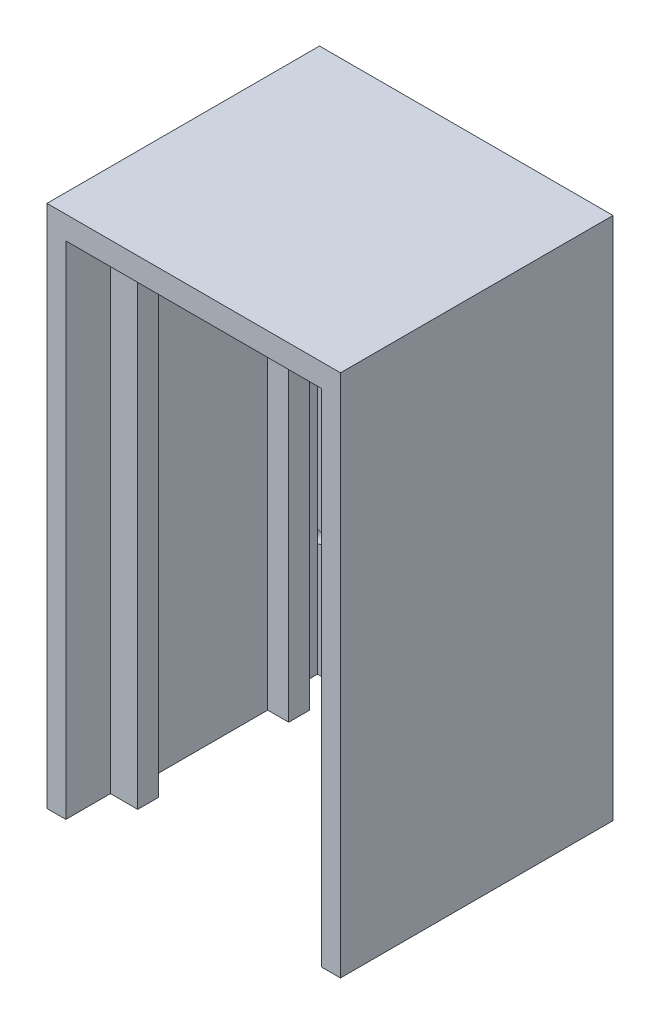
ISO-10303-21;
HEADER;
FILE_DESCRIPTION(('STEP AP214'),'2;1');
FILE_NAME('part.step','',(''),(''),'','','');
FILE_SCHEMA(('AUTOMOTIVE_DESIGN { 1 0 10303 214 1 1 1 1 }'));
ENDSEC;
DATA;
#1=APPLICATION_CONTEXT('core data for automotive mechanical design processes');
#2=APPLICATION_PROTOCOL_DEFINITION('international standard','automotive_design',2000,#1);
#3=PRODUCT_CONTEXT('',#1,'mechanical');
#4=PRODUCT('Part','Part','',(#3));
#5=PRODUCT_RELATED_PRODUCT_CATEGORY('part','',(#4));
#6=PRODUCT_DEFINITION_FORMATION('','',#4);
#7=PRODUCT_DEFINITION_CONTEXT('part definition',#1,'design');
#8=PRODUCT_DEFINITION('design','',#6,#7);
#9=PRODUCT_DEFINITION_SHAPE('','',#8);
#10=(LENGTH_UNIT() NAMED_UNIT(*) SI_UNIT(.MILLI.,.METRE.));
#11=(NAMED_UNIT(*) PLANE_ANGLE_UNIT() SI_UNIT($,.RADIAN.));
#12=(NAMED_UNIT(*) SI_UNIT($,.STERADIAN.) SOLID_ANGLE_UNIT());
#13=UNCERTAINTY_MEASURE_WITH_UNIT(LENGTH_MEASURE(1.E-05),#10,'distance_accuracy_value','');
#14=(GEOMETRIC_REPRESENTATION_CONTEXT(3) GLOBAL_UNCERTAINTY_ASSIGNED_CONTEXT((#13)) GLOBAL_UNIT_ASSIGNED_CONTEXT((#10,
#11,#12)) REPRESENTATION_CONTEXT('',''));
#15=CARTESIAN_POINT('',(0.,0.,0.));
#16=DIRECTION('',(0.,0.,1.));
#17=DIRECTION('',(1.,0.,0.));
#18=AXIS2_PLACEMENT_3D('',#15,#16,#17);
#19=CARTESIAN_POINT('',(36.,71.0305,5.));
#20=DIRECTION('',(0.,-1.,0.));
#21=DIRECTION('',(0.,0.,-1.));
#22=AXIS2_PLACEMENT_3D('',#19,#20,#21);
#23=PLANE('',#22);
#24=DIRECTION('',(0.,0.,1.));
#25=VECTOR('',#24,1.);
#26=CARTESIAN_POINT('',(-35.,71.0305,0.));
#27=LINE('',#26,#25);
#28=CARTESIAN_POINT('',(-35.,71.0305,0.));
#29=VERTEX_POINT('',#28);
#30=CARTESIAN_POINT('',(-35.,71.0305,65.));
#31=VERTEX_POINT('',#30);
#32=EDGE_CURVE('E218',#29,#31,#27,.T.);
#33=ORIENTED_EDGE('',*,*,#32,.T.);
#34=DIRECTION('',(-1.,0.,0.));
#35=VECTOR('',#34,1.);
#36=CARTESIAN_POINT('',(0.,71.0305,65.));
#37=LINE('',#36,#35);
#38=CARTESIAN_POINT('',(35.,71.0305,65.));
#39=VERTEX_POINT('',#38);
#40=EDGE_CURVE('E307',#39,#31,#37,.T.);
#41=ORIENTED_EDGE('',*,*,#40,.F.);
#42=DIRECTION('',(0.,0.,1.));
#43=VECTOR('',#42,1.);
#44=CARTESIAN_POINT('',(35.,71.0305,0.));
#45=LINE('',#44,#43);
#46=CARTESIAN_POINT('',(35.,71.0305,0.));
#47=VERTEX_POINT('',#46);
#48=EDGE_CURVE('E70',#47,#39,#45,.T.);
#49=ORIENTED_EDGE('',*,*,#48,.F.);
#50=DIRECTION('',(-1.,0.,0.));
#51=VECTOR('',#50,1.);
#52=CARTESIAN_POINT('',(36.,71.0305,0.));
#53=LINE('',#52,#51);
#54=EDGE_CURVE('E234',#47,#29,#53,.T.);
#55=ORIENTED_EDGE('',*,*,#54,.T.);
#56=EDGE_LOOP('',(#33,#41,#49,#55));
#57=FACE_BOUND('',#56,.T.);
#58=ADVANCED_FACE('F48',(#57),#23,.F.);
#59=CARTESIAN_POINT('',(36.,-53.9695,5.));
#60=DIRECTION('',(0.,1.,0.));
#61=DIRECTION('',(0.,0.,1.));
#62=AXIS2_PLACEMENT_3D('',#59,#60,#61);
#63=PLANE('',#62);
#64=DIRECTION('',(0.,0.,1.));
#65=VECTOR('',#64,1.);
#66=CARTESIAN_POINT('',(-35.,-53.9695,5.00000000000001));
#67=LINE('',#66,#65);
#68=CARTESIAN_POINT('',(-35.,-53.9695,0.));
#69=VERTEX_POINT('',#68);
#70=CARTESIAN_POINT('',(-35.,-53.9695,65.));
#71=VERTEX_POINT('',#70);
#72=EDGE_CURVE('E63',#69,#71,#67,.T.);
#73=ORIENTED_EDGE('',*,*,#72,.F.);
#74=DIRECTION('',(1.,0.,0.));
#75=VECTOR('',#74,1.);
#76=CARTESIAN_POINT('',(36.,-53.9695,0.));
#77=LINE('',#76,#75);
#78=CARTESIAN_POINT('',(35.,-53.9695,0.));
#79=VERTEX_POINT('',#78);
#80=EDGE_CURVE('E236',#69,#79,#77,.T.);
#81=ORIENTED_EDGE('',*,*,#80,.T.);
#82=DIRECTION('',(0.,0.,1.));
#83=VECTOR('',#82,1.);
#84=CARTESIAN_POINT('',(35.,-53.9695,5.));
#85=LINE('',#84,#83);
#86=CARTESIAN_POINT('',(35.,-53.9695,65.));
#87=VERTEX_POINT('',#86);
#88=EDGE_CURVE('E238',#79,#87,#85,.T.);
#89=ORIENTED_EDGE('',*,*,#88,.T.);
#90=DIRECTION('',(1.,0.,0.));
#91=VECTOR('',#90,1.);
#92=CARTESIAN_POINT('',(0.,-53.9695,65.));
#93=LINE('',#92,#91);
#94=CARTESIAN_POINT('',(30.5,-53.9695,65.));
#95=VERTEX_POINT('',#94);
#96=EDGE_CURVE('E304',#95,#87,#93,.T.);
#97=ORIENTED_EDGE('',*,*,#96,.F.);
#98=DIRECTION('',(0.,0.,-1.));
#99=VECTOR('',#98,1.);
#100=CARTESIAN_POINT('',(30.5,-53.9695,65.));
#101=LINE('',#100,#99);
#102=CARTESIAN_POINT('',(30.5,-53.9695,54.3563345930218));
#103=VERTEX_POINT('',#102);
#104=EDGE_CURVE('E324',#95,#103,#101,.T.);
#105=ORIENTED_EDGE('',*,*,#104,.T.);
#106=DIRECTION('',(1.,0.,0.));
#107=VECTOR('',#106,1.);
#108=CARTESIAN_POINT('',(0.,-53.9695,54.3563345930218));
#109=LINE('',#108,#107);
#110=CARTESIAN_POINT('',(24.,-53.9695,54.3563345930218));
#111=VERTEX_POINT('',#110);
#112=EDGE_CURVE('E459',#111,#103,#109,.T.);
#113=ORIENTED_EDGE('',*,*,#112,.F.);
#114=DIRECTION('',(0.,0.,1.));
#115=VECTOR('',#114,1.);
#116=CARTESIAN_POINT('',(24.,-53.9695,0.));
#117=LINE('',#116,#115);
#118=CARTESIAN_POINT('',(24.,-53.9695,49.3563345930218));
#119=VERTEX_POINT('',#118);
#120=EDGE_CURVE('E872',#119,#111,#117,.T.);
#121=ORIENTED_EDGE('',*,*,#120,.F.);
#122=DIRECTION('',(1.,0.,0.));
#123=VECTOR('',#122,1.);
#124=CARTESIAN_POINT('',(0.,-53.9695,49.3563345930218));
#125=LINE('',#124,#123);
#126=CARTESIAN_POINT('',(29.,-53.9695,49.3563345930218));
#127=VERTEX_POINT('',#126);
#128=EDGE_CURVE('E877',#119,#127,#125,.T.);
#129=ORIENTED_EDGE('',*,*,#128,.T.);
#130=DIRECTION('',(0.,0.,1.));
#131=VECTOR('',#130,1.);
#132=CARTESIAN_POINT('',(29.,-53.9695,0.));
#133=LINE('',#132,#131);
#134=CARTESIAN_POINT('',(29.,-53.9695,18.3563345930218));
#135=VERTEX_POINT('',#134);
#136=EDGE_CURVE('E881',#135,#127,#133,.T.);
#137=ORIENTED_EDGE('',*,*,#136,.F.);
#138=DIRECTION('',(1.,0.,0.));
#139=VECTOR('',#138,1.);
#140=CARTESIAN_POINT('',(0.,-53.9695,18.3563345930218));
#141=LINE('',#140,#139);
#142=CARTESIAN_POINT('',(24.,-53.9695,18.3563345930218));
#143=VERTEX_POINT('',#142);
#144=EDGE_CURVE('E475',#143,#135,#141,.T.);
#145=ORIENTED_EDGE('',*,*,#144,.F.);
#146=CARTESIAN_POINT('',(24.,-53.9695,13.3563345930218));
#147=VERTEX_POINT('',#146);
#148=EDGE_CURVE('E847',#147,#143,#117,.T.);
#149=ORIENTED_EDGE('',*,*,#148,.F.);
#150=DIRECTION('',(1.,0.,0.));
#151=VECTOR('',#150,1.);
#152=CARTESIAN_POINT('',(0.,-53.9695,13.3563345930218));
#153=LINE('',#152,#151);
#154=CARTESIAN_POINT('',(30.5,-53.9695,13.3563345930218));
#155=VERTEX_POINT('',#154);
#156=EDGE_CURVE('E562',#147,#155,#153,.T.);
#157=ORIENTED_EDGE('',*,*,#156,.T.);
#158=CARTESIAN_POINT('',(30.5,-53.9695,5.));
#159=VERTEX_POINT('',#158);
#160=EDGE_CURVE('E322',#155,#159,#101,.T.);
#161=ORIENTED_EDGE('',*,*,#160,.T.);
#162=DIRECTION('',(1.,0.,0.));
#163=VECTOR('',#162,1.);
#164=CARTESIAN_POINT('',(36.,-53.9695,5.));
#165=LINE('',#164,#163);
#166=CARTESIAN_POINT('',(-30.5,-53.9695,5.));
#167=VERTEX_POINT('',#166);
#168=EDGE_CURVE('E245',#167,#159,#165,.T.);
#169=ORIENTED_EDGE('',*,*,#168,.F.);
#170=DIRECTION('',(0.,0.,-1.));
#171=VECTOR('',#170,1.);
#172=CARTESIAN_POINT('',(-30.5,-53.9695,65.));
#173=LINE('',#172,#171);
#174=CARTESIAN_POINT('',(-30.5,-53.9695,13.3563345930218));
#175=VERTEX_POINT('',#174);
#176=EDGE_CURVE('E312',#175,#167,#173,.T.);
#177=ORIENTED_EDGE('',*,*,#176,.F.);
#178=DIRECTION('',(1.,0.,0.));
#179=VECTOR('',#178,1.);
#180=CARTESIAN_POINT('',(0.,-53.9695,13.3563345930218));
#181=LINE('',#180,#179);
#182=CARTESIAN_POINT('',(-24.,-53.9695,13.3563345930218));
#183=VERTEX_POINT('',#182);
#184=EDGE_CURVE('E479',#175,#183,#181,.T.);
#185=ORIENTED_EDGE('',*,*,#184,.T.);
#186=DIRECTION('',(0.,0.,1.));
#187=VECTOR('',#186,1.);
#188=CARTESIAN_POINT('',(-24.,-53.9695,0.));
#189=LINE('',#188,#187);
#190=CARTESIAN_POINT('',(-24.,-53.9695,18.3563345930218));
#191=VERTEX_POINT('',#190);
#192=EDGE_CURVE('E501',#183,#191,#189,.T.);
#193=ORIENTED_EDGE('',*,*,#192,.T.);
#194=DIRECTION('',(1.,0.,0.));
#195=VECTOR('',#194,1.);
#196=CARTESIAN_POINT('',(0.,-53.9695,18.3563345930218));
#197=LINE('',#196,#195);
#198=CARTESIAN_POINT('',(-29.,-53.9695,18.3563345930218));
#199=VERTEX_POINT('',#198);
#200=EDGE_CURVE('E505',#199,#191,#197,.T.);
#201=ORIENTED_EDGE('',*,*,#200,.F.);
#202=DIRECTION('',(0.,0.,1.));
#203=VECTOR('',#202,1.);
#204=CARTESIAN_POINT('',(-29.,-53.9695,0.));
#205=LINE('',#204,#203);
#206=CARTESIAN_POINT('',(-29.,-53.9695,49.3563345930218));
#207=VERTEX_POINT('',#206);
#208=EDGE_CURVE('E510',#199,#207,#205,.T.);
#209=ORIENTED_EDGE('',*,*,#208,.T.);
#210=DIRECTION('',(1.,0.,0.));
#211=VECTOR('',#210,1.);
#212=CARTESIAN_POINT('',(0.,-53.9695,49.3563345930218));
#213=LINE('',#212,#211);
#214=CARTESIAN_POINT('',(-24.,-53.9695,49.3563345930218));
#215=VERTEX_POINT('',#214);
#216=EDGE_CURVE('E514',#207,#215,#213,.T.);
#217=ORIENTED_EDGE('',*,*,#216,.T.);
#218=CARTESIAN_POINT('',(-24.,-53.9695,54.3563345930218));
#219=VERTEX_POINT('',#218);
#220=EDGE_CURVE('E506',#215,#219,#189,.T.);
#221=ORIENTED_EDGE('',*,*,#220,.T.);
#222=DIRECTION('',(1.,0.,0.));
#223=VECTOR('',#222,1.);
#224=CARTESIAN_POINT('',(0.,-53.9695,54.3563345930218));
#225=LINE('',#224,#223);
#226=CARTESIAN_POINT('',(-30.5,-53.9695,54.3563345930218));
#227=VERTEX_POINT('',#226);
#228=EDGE_CURVE('E518',#227,#219,#225,.T.);
#229=ORIENTED_EDGE('',*,*,#228,.F.);
#230=CARTESIAN_POINT('',(-30.5,-53.9695,65.));
#231=VERTEX_POINT('',#230);
#232=EDGE_CURVE('E317',#231,#227,#173,.T.);
#233=ORIENTED_EDGE('',*,*,#232,.F.);
#234=EDGE_CURVE('E308',#71,#231,#93,.T.);
#235=ORIENTED_EDGE('',*,*,#234,.F.);
#236=EDGE_LOOP('',(#73,#81,#89,#97,#105,#113,#121,#129,#137,#145,#149,#157,#161,#169,#177,#185,
#193,#201,#209,#217,#221,#229,#233,#235));
#237=FACE_BOUND('',#236,.T.);
#238=ADVANCED_FACE('F394',(#237),#63,.F.);
#239=CARTESIAN_POINT('',(0.,0.,0.));
#240=DIRECTION('',(0.,0.,-1.));
#241=DIRECTION('',(-1.,0.,0.));
#242=AXIS2_PLACEMENT_3D('',#239,#240,#241);
#243=PLANE('',#242);
#244=CARTESIAN_POINT('',(-30.5,-25.4695,0.));
#245=DIRECTION('',(0.,0.,1.));
#246=DIRECTION('',(1.,0.,0.));
#247=AXIS2_PLACEMENT_3D('',#244,#245,#246);
#248=CIRCLE('',#247,1.50000000000001);
#249=CARTESIAN_POINT('',(-29.,-25.4695,0.));
#250=VERTEX_POINT('',#249);
#251=EDGE_CURVE('E364',#250,#250,#248,.T.);
#252=ORIENTED_EDGE('',*,*,#251,.T.);
#253=EDGE_LOOP('',(#252));
#254=FACE_BOUND('',#253,.T.);
#255=CARTESIAN_POINT('',(30.5,-25.4695,0.));
#256=DIRECTION('',(0.,0.,1.));
#257=DIRECTION('',(1.,0.,0.));
#258=AXIS2_PLACEMENT_3D('',#255,#256,#257);
#259=CIRCLE('',#258,1.5);
#260=CARTESIAN_POINT('',(32.,-25.4695,0.));
#261=VERTEX_POINT('',#260);
#262=EDGE_CURVE('E355',#261,#261,#259,.T.);
#263=ORIENTED_EDGE('',*,*,#262,.T.);
#264=EDGE_LOOP('',(#263));
#265=FACE_BOUND('',#264,.T.);
#266=CARTESIAN_POINT('',(0.,21.0305,0.));
#267=DIRECTION('',(0.,0.,1.));
#268=DIRECTION('',(1.,0.,0.));
#269=AXIS2_PLACEMENT_3D('',#266,#267,#268);
#270=CIRCLE('',#269,1.5);
#271=CARTESIAN_POINT('',(1.50000000000001,21.0305,0.));
#272=VERTEX_POINT('',#271);
#273=EDGE_CURVE('E342',#272,#272,#270,.T.);
#274=ORIENTED_EDGE('',*,*,#273,.T.);
#275=EDGE_LOOP('',(#274));
#276=FACE_BOUND('',#275,.T.);
#277=CARTESIAN_POINT('',(30.5,67.5305,0.));
#278=DIRECTION('',(0.,0.,1.));
#279=DIRECTION('',(1.,0.,0.));
#280=AXIS2_PLACEMENT_3D('',#277,#278,#279);
#281=CIRCLE('',#280,1.5);
#282=CARTESIAN_POINT('',(32.,67.5305,0.));
#283=VERTEX_POINT('',#282);
#284=EDGE_CURVE('E248',#283,#283,#281,.T.);
#285=ORIENTED_EDGE('',*,*,#284,.T.);
#286=EDGE_LOOP('',(#285));
#287=FACE_BOUND('',#286,.T.);
#288=CARTESIAN_POINT('',(-30.5,67.5305,0.));
#289=DIRECTION('',(0.,0.,1.));
#290=DIRECTION('',(1.,0.,0.));
#291=AXIS2_PLACEMENT_3D('',#288,#289,#290);
#292=CIRCLE('',#291,1.5);
#293=CARTESIAN_POINT('',(-29.,67.5305,0.));
#294=VERTEX_POINT('',#293);
#295=EDGE_CURVE('E241',#294,#294,#292,.T.);
#296=ORIENTED_EDGE('',*,*,#295,.T.);
#297=EDGE_LOOP('',(#296));
#298=FACE_BOUND('',#297,.T.);
#299=ORIENTED_EDGE('',*,*,#80,.F.);
#300=DIRECTION('',(0.,1.,0.));
#301=VECTOR('',#300,1.);
#302=CARTESIAN_POINT('',(-35.,-86.9695000000001,0.));
#303=LINE('',#302,#301);
#304=EDGE_CURVE('E221',#69,#29,#303,.T.);
#305=ORIENTED_EDGE('',*,*,#304,.T.);
#306=ORIENTED_EDGE('',*,*,#54,.F.);
#307=DIRECTION('',(0.,1.,0.));
#308=VECTOR('',#307,1.);
#309=CARTESIAN_POINT('',(35.,-86.9695000000001,0.));
#310=LINE('',#309,#308);
#311=EDGE_CURVE('E227',#79,#47,#310,.T.);
#312=ORIENTED_EDGE('',*,*,#311,.F.);
#313=EDGE_LOOP('',(#299,#305,#306,#312));
#314=FACE_BOUND('',#313,.T.);
#315=ADVANCED_FACE('F232',(#254,#265,#276,#287,#298,#314),#243,.T.);
#316=CARTESIAN_POINT('',(0.,0.,65.));
#317=DIRECTION('',(0.,0.,1.));
#318=DIRECTION('',(1.,0.,0.));
#319=AXIS2_PLACEMENT_3D('',#316,#317,#318);
#320=PLANE('',#319);
#321=ORIENTED_EDGE('',*,*,#40,.T.);
#322=DIRECTION('',(0.,-1.,0.));
#323=VECTOR('',#322,1.);
#324=CARTESIAN_POINT('',(-35.,0.,65.));
#325=LINE('',#324,#323);
#326=EDGE_CURVE('E11',#31,#71,#325,.T.);
#327=ORIENTED_EDGE('',*,*,#326,.T.);
#328=ORIENTED_EDGE('',*,*,#234,.T.);
#329=DIRECTION('',(0.,-1.,0.));
#330=VECTOR('',#329,1.);
#331=CARTESIAN_POINT('',(-30.5,0.,65.));
#332=LINE('',#331,#330);
#333=CARTESIAN_POINT('',(-30.5,65.5305,65.));
#334=VERTEX_POINT('',#333);
#335=EDGE_CURVE('E292',#334,#231,#332,.T.);
#336=ORIENTED_EDGE('',*,*,#335,.F.);
#337=DIRECTION('',(-1.,0.,0.));
#338=VECTOR('',#337,1.);
#339=CARTESIAN_POINT('',(0.,65.5305,65.));
#340=LINE('',#339,#338);
#341=CARTESIAN_POINT('',(30.5,65.5305,65.));
#342=VERTEX_POINT('',#341);
#343=EDGE_CURVE('E296',#342,#334,#340,.T.);
#344=ORIENTED_EDGE('',*,*,#343,.F.);
#345=DIRECTION('',(0.,1.,0.));
#346=VECTOR('',#345,1.);
#347=CARTESIAN_POINT('',(30.5,0.,65.));
#348=LINE('',#347,#346);
#349=EDGE_CURVE('E300',#95,#342,#348,.T.);
#350=ORIENTED_EDGE('',*,*,#349,.F.);
#351=ORIENTED_EDGE('',*,*,#96,.T.);
#352=DIRECTION('',(0.,-1.,0.));
#353=VECTOR('',#352,1.);
#354=CARTESIAN_POINT('',(35.,0.,65.));
#355=LINE('',#354,#353);
#356=EDGE_CURVE('E56',#39,#87,#355,.T.);
#357=ORIENTED_EDGE('',*,*,#356,.F.);
#358=EDGE_LOOP('',(#321,#327,#328,#336,#344,#350,#351,#357));
#359=FACE_BOUND('',#358,.T.);
#360=ADVANCED_FACE('F403',(#359),#320,.T.);
#361=CARTESIAN_POINT('',(30.5,0.,65.));
#362=DIRECTION('',(-1.,0.,0.));
#363=DIRECTION('',(0.,-1.,0.));
#364=AXIS2_PLACEMENT_3D('',#361,#362,#363);
#365=PLANE('',#364);
#366=DIRECTION('',(0.,0.,-1.));
#367=VECTOR('',#366,1.);
#368=CARTESIAN_POINT('',(30.5,65.5305,65.));
#369=LINE('',#368,#367);
#370=CARTESIAN_POINT('',(30.5,65.5305,54.3563345930218));
#371=VERTEX_POINT('',#370);
#372=EDGE_CURVE('E329',#342,#371,#369,.T.);
#373=ORIENTED_EDGE('',*,*,#372,.T.);
#374=DIRECTION('',(0.,-1.,0.));
#375=VECTOR('',#374,1.);
#376=CARTESIAN_POINT('',(30.5,107.042546444376,54.3563345930218));
#377=LINE('',#376,#375);
#378=EDGE_CURVE('E449',#371,#103,#377,.T.);
#379=ORIENTED_EDGE('',*,*,#378,.T.);
#380=ORIENTED_EDGE('',*,*,#104,.F.);
#381=ORIENTED_EDGE('',*,*,#349,.T.);
#382=EDGE_LOOP('',(#373,#379,#380,#381));
#383=FACE_BOUND('',#382,.T.);
#384=ADVANCED_FACE('F436',(#383),#365,.T.);
#385=CARTESIAN_POINT('',(0.,65.5305,65.));
#386=DIRECTION('',(0.,-1.,0.));
#387=DIRECTION('',(0.,0.,-1.));
#388=AXIS2_PLACEMENT_3D('',#385,#386,#387);
#389=PLANE('',#388);
#390=DIRECTION('',(0.,0.,-1.));
#391=VECTOR('',#390,1.);
#392=CARTESIAN_POINT('',(24.,65.5305,0.));
#393=LINE('',#392,#391);
#394=CARTESIAN_POINT('',(24.,65.5305,54.3563345930218));
#395=VERTEX_POINT('',#394);
#396=CARTESIAN_POINT('',(24.,65.5305,49.3563345930218));
#397=VERTEX_POINT('',#396);
#398=EDGE_CURVE('E850',#395,#397,#393,.T.);
#399=ORIENTED_EDGE('',*,*,#398,.F.);
#400=DIRECTION('',(-1.,0.,0.));
#401=VECTOR('',#400,1.);
#402=CARTESIAN_POINT('',(0.,65.5305,54.3563345930218));
#403=LINE('',#402,#401);
#404=EDGE_CURVE('E456',#371,#395,#403,.T.);
#405=ORIENTED_EDGE('',*,*,#404,.F.);
#406=ORIENTED_EDGE('',*,*,#372,.F.);
#407=ORIENTED_EDGE('',*,*,#343,.T.);
#408=DIRECTION('',(0.,0.,-1.));
#409=VECTOR('',#408,1.);
#410=CARTESIAN_POINT('',(-30.5,65.5305,65.));
#411=LINE('',#410,#409);
#412=CARTESIAN_POINT('',(-30.5,65.5305,54.3563345930218));
#413=VERTEX_POINT('',#412);
#414=EDGE_CURVE('E334',#334,#413,#411,.T.);
#415=ORIENTED_EDGE('',*,*,#414,.T.);
#416=DIRECTION('',(-1.,0.,0.));
#417=VECTOR('',#416,1.);
#418=CARTESIAN_POINT('',(0.,65.5305,54.3563345930218));
#419=LINE('',#418,#417);
#420=CARTESIAN_POINT('',(-24.,65.5305,54.3563345930218));
#421=VERTEX_POINT('',#420);
#422=EDGE_CURVE('E286',#421,#413,#419,.T.);
#423=ORIENTED_EDGE('',*,*,#422,.F.);
#424=DIRECTION('',(0.,0.,-1.));
#425=VECTOR('',#424,1.);
#426=CARTESIAN_POINT('',(-24.,65.5305,0.));
#427=LINE('',#426,#425);
#428=CARTESIAN_POINT('',(-24.,65.5305,49.3563345930218));
#429=VERTEX_POINT('',#428);
#430=EDGE_CURVE('E492',#421,#429,#427,.T.);
#431=ORIENTED_EDGE('',*,*,#430,.T.);
#432=DIRECTION('',(-1.,0.,0.));
#433=VECTOR('',#432,1.);
#434=CARTESIAN_POINT('',(0.,65.5305,49.3563345930218));
#435=LINE('',#434,#433);
#436=CARTESIAN_POINT('',(-29.,65.5305,49.3563345930218));
#437=VERTEX_POINT('',#436);
#438=EDGE_CURVE('E489',#429,#437,#435,.T.);
#439=ORIENTED_EDGE('',*,*,#438,.T.);
#440=DIRECTION('',(0.,0.,-1.));
#441=VECTOR('',#440,1.);
#442=CARTESIAN_POINT('',(-29.,65.5305,0.));
#443=LINE('',#442,#441);
#444=CARTESIAN_POINT('',(-29.,65.5305,18.3563345930218));
#445=VERTEX_POINT('',#444);
#446=EDGE_CURVE('E485',#437,#445,#443,.T.);
#447=ORIENTED_EDGE('',*,*,#446,.T.);
#448=DIRECTION('',(-1.,0.,0.));
#449=VECTOR('',#448,1.);
#450=CARTESIAN_POINT('',(0.,65.5305,18.3563345930218));
#451=LINE('',#450,#449);
#452=CARTESIAN_POINT('',(-24.,65.5305,18.3563345930218));
#453=VERTEX_POINT('',#452);
#454=EDGE_CURVE('E481',#453,#445,#451,.T.);
#455=ORIENTED_EDGE('',*,*,#454,.F.);
#456=DIRECTION('',(0.,0.,-1.));
#457=VECTOR('',#456,1.);
#458=CARTESIAN_POINT('',(-24.,65.5305,0.));
#459=LINE('',#458,#457);
#460=CARTESIAN_POINT('',(-24.,65.5305,13.3563345930218));
#461=VERTEX_POINT('',#460);
#462=EDGE_CURVE('E276',#453,#461,#459,.T.);
#463=ORIENTED_EDGE('',*,*,#462,.T.);
#464=DIRECTION('',(-1.,0.,0.));
#465=VECTOR('',#464,1.);
#466=CARTESIAN_POINT('',(0.,65.5305,13.3563345930218));
#467=LINE('',#466,#465);
#468=CARTESIAN_POINT('',(-30.5,65.5305,13.3563345930218));
#469=VERTEX_POINT('',#468);
#470=EDGE_CURVE('E280',#461,#469,#467,.T.);
#471=ORIENTED_EDGE('',*,*,#470,.T.);
#472=CARTESIAN_POINT('',(-30.5,65.5305,5.));
#473=VERTEX_POINT('',#472);
#474=EDGE_CURVE('E333',#469,#473,#411,.T.);
#475=ORIENTED_EDGE('',*,*,#474,.T.);
#476=DIRECTION('',(-1.,0.,0.));
#477=VECTOR('',#476,1.);
#478=CARTESIAN_POINT('',(0.,65.5305,5.));
#479=LINE('',#478,#477);
#480=CARTESIAN_POINT('',(30.5,65.5305,5.));
#481=VERTEX_POINT('',#480);
#482=EDGE_CURVE('E273',#481,#473,#479,.T.);
#483=ORIENTED_EDGE('',*,*,#482,.F.);
#484=CARTESIAN_POINT('',(30.5,65.5305,13.3563345930218));
#485=VERTEX_POINT('',#484);
#486=EDGE_CURVE('E328',#485,#481,#369,.T.);
#487=ORIENTED_EDGE('',*,*,#486,.F.);
#488=DIRECTION('',(-1.,0.,0.));
#489=VECTOR('',#488,1.);
#490=CARTESIAN_POINT('',(0.,65.5305,13.3563345930218));
#491=LINE('',#490,#489);
#492=CARTESIAN_POINT('',(24.,65.5305,13.3563345930218));
#493=VERTEX_POINT('',#492);
#494=EDGE_CURVE('E476',#485,#493,#491,.T.);
#495=ORIENTED_EDGE('',*,*,#494,.T.);
#496=DIRECTION('',(0.,0.,-1.));
#497=VECTOR('',#496,1.);
#498=CARTESIAN_POINT('',(24.,65.5305,0.));
#499=LINE('',#498,#497);
#500=CARTESIAN_POINT('',(24.,65.5305,18.3563345930218));
#501=VERTEX_POINT('',#500);
#502=EDGE_CURVE('E480',#501,#493,#499,.T.);
#503=ORIENTED_EDGE('',*,*,#502,.F.);
#504=DIRECTION('',(-1.,0.,0.));
#505=VECTOR('',#504,1.);
#506=CARTESIAN_POINT('',(0.,65.5305,18.3563345930218));
#507=LINE('',#506,#505);
#508=CARTESIAN_POINT('',(29.,65.5305,18.3563345930218));
#509=VERTEX_POINT('',#508);
#510=EDGE_CURVE('E862',#509,#501,#507,.T.);
#511=ORIENTED_EDGE('',*,*,#510,.F.);
#512=DIRECTION('',(0.,0.,-1.));
#513=VECTOR('',#512,1.);
#514=CARTESIAN_POINT('',(29.,65.5305,0.));
#515=LINE('',#514,#513);
#516=CARTESIAN_POINT('',(29.,65.5305,49.3563345930218));
#517=VERTEX_POINT('',#516);
#518=EDGE_CURVE('E858',#517,#509,#515,.T.);
#519=ORIENTED_EDGE('',*,*,#518,.F.);
#520=DIRECTION('',(-1.,0.,0.));
#521=VECTOR('',#520,1.);
#522=CARTESIAN_POINT('',(0.,65.5305,49.3563345930218));
#523=LINE('',#522,#521);
#524=EDGE_CURVE('E855',#517,#397,#523,.T.);
#525=ORIENTED_EDGE('',*,*,#524,.T.);
#526=EDGE_LOOP('',(#399,#405,#406,#407,#415,#423,#431,#439,#447,#455,#463,#471,#475,#483,#487,
#495,#503,#511,#519,#525));
#527=FACE_BOUND('',#526,.T.);
#528=ADVANCED_FACE('F434',(#527),#389,.T.);
#529=CARTESIAN_POINT('',(-30.5,0.,65.));
#530=DIRECTION('',(1.,0.,0.));
#531=DIRECTION('',(0.,1.,0.));
#532=AXIS2_PLACEMENT_3D('',#529,#530,#531);
#533=PLANE('',#532);
#534=ORIENTED_EDGE('',*,*,#232,.T.);
#535=DIRECTION('',(0.,-1.,0.));
#536=VECTOR('',#535,1.);
#537=CARTESIAN_POINT('',(-30.5,107.042546444376,54.3563345930218));
#538=LINE('',#537,#536);
#539=EDGE_CURVE('E524',#413,#227,#538,.T.);
#540=ORIENTED_EDGE('',*,*,#539,.F.);
#541=ORIENTED_EDGE('',*,*,#414,.F.);
#542=ORIENTED_EDGE('',*,*,#335,.T.);
#543=EDGE_LOOP('',(#534,#540,#541,#542));
#544=FACE_BOUND('',#543,.T.);
#545=ADVANCED_FACE('F410',(#544),#533,.T.);
#546=CARTESIAN_POINT('',(0.,0.,5.));
#547=DIRECTION('',(0.,0.,-1.));
#548=DIRECTION('',(-1.,0.,0.));
#549=AXIS2_PLACEMENT_3D('',#546,#547,#548);
#550=PLANE('',#549);
#551=CARTESIAN_POINT('',(0.,21.0305,5.));
#552=DIRECTION('',(0.,0.,1.));
#553=DIRECTION('',(1.,0.,0.));
#554=AXIS2_PLACEMENT_3D('',#551,#552,#553);
#555=CIRCLE('',#554,1.5);
#556=CARTESIAN_POINT('',(1.50000000000001,21.0305,5.));
#557=VERTEX_POINT('',#556);
#558=EDGE_CURVE('E351',#557,#557,#555,.T.);
#559=ORIENTED_EDGE('',*,*,#558,.F.);
#560=EDGE_LOOP('',(#559));
#561=FACE_BOUND('',#560,.T.);
#562=CARTESIAN_POINT('',(-30.5,-25.4695,5.));
#563=DIRECTION('',(0.,0.,1.));
#564=DIRECTION('',(1.,0.,0.));
#565=AXIS2_PLACEMENT_3D('',#562,#563,#564);
#566=CIRCLE('',#565,1.50000000000001);
#567=CARTESIAN_POINT('',(-30.5,-26.9695,5.));
#568=VERTEX_POINT('',#567);
#569=CARTESIAN_POINT('',(-30.5,-23.9695,5.));
#570=VERTEX_POINT('',#569);
#571=EDGE_CURVE('E347',#568,#570,#566,.T.);
#572=ORIENTED_EDGE('',*,*,#571,.F.);
#573=DIRECTION('',(0.,-1.,0.));
#574=VECTOR('',#573,1.);
#575=CARTESIAN_POINT('',(-30.5,0.,5.));
#576=LINE('',#575,#574);
#577=EDGE_CURVE('E252',#568,#167,#576,.T.);
#578=ORIENTED_EDGE('',*,*,#577,.T.);
#579=ORIENTED_EDGE('',*,*,#168,.T.);
#580=DIRECTION('',(0.,1.,0.));
#581=VECTOR('',#580,1.);
#582=CARTESIAN_POINT('',(30.5,0.,5.));
#583=LINE('',#582,#581);
#584=CARTESIAN_POINT('',(30.5,-26.9695,5.));
#585=VERTEX_POINT('',#584);
#586=EDGE_CURVE('E267',#159,#585,#583,.T.);
#587=ORIENTED_EDGE('',*,*,#586,.T.);
#588=CARTESIAN_POINT('',(30.5,-25.4695,5.));
#589=DIRECTION('',(0.,0.,1.));
#590=DIRECTION('',(1.,0.,0.));
#591=AXIS2_PLACEMENT_3D('',#588,#589,#590);
#592=CIRCLE('',#591,1.5);
#593=CARTESIAN_POINT('',(30.5,-23.9695,5.));
#594=VERTEX_POINT('',#593);
#595=EDGE_CURVE('E359',#594,#585,#592,.T.);
#596=ORIENTED_EDGE('',*,*,#595,.F.);
#597=EDGE_CURVE('E256',#594,#481,#583,.T.);
#598=ORIENTED_EDGE('',*,*,#597,.T.);
#599=ORIENTED_EDGE('',*,*,#482,.T.);
#600=EDGE_CURVE('E258',#473,#570,#576,.T.);
#601=ORIENTED_EDGE('',*,*,#600,.T.);
#602=EDGE_LOOP('',(#572,#578,#579,#587,#596,#598,#599,#601));
#603=FACE_BOUND('',#602,.T.);
#604=ADVANCED_FACE('F407',(#561,#603),#550,.F.);
#605=CARTESIAN_POINT('',(-30.5,67.5305,5.));
#606=DIRECTION('',(0.,0.,-1.));
#607=DIRECTION('',(-1.,0.,0.));
#608=AXIS2_PLACEMENT_3D('',#605,#606,#607);
#609=CYLINDRICAL_SURFACE('',#608,1.5);
#610=CARTESIAN_POINT('',(-30.5,67.5305,5.));
#611=DIRECTION('',(0.,0.,1.));
#612=DIRECTION('',(1.,0.,0.));
#613=AXIS2_PLACEMENT_3D('',#610,#611,#612);
#614=CIRCLE('',#613,1.5);
#615=CARTESIAN_POINT('',(-29.,67.5305,5.));
#616=VERTEX_POINT('',#615);
#617=EDGE_CURVE('E338',#616,#616,#614,.T.);
#618=ORIENTED_EDGE('',*,*,#617,.T.);
#619=EDGE_LOOP('',(#618));
#620=FACE_BOUND('',#619,.T.);
#621=ORIENTED_EDGE('',*,*,#295,.F.);
#622=EDGE_LOOP('',(#621));
#623=FACE_BOUND('',#622,.T.);
#624=ADVANCED_FACE('F376',(#620,#623),#609,.F.);
#625=CARTESIAN_POINT('',(30.5,67.5305,5.));
#626=DIRECTION('',(0.,0.,-1.));
#627=DIRECTION('',(-1.,0.,0.));
#628=AXIS2_PLACEMENT_3D('',#625,#626,#627);
#629=CYLINDRICAL_SURFACE('',#628,1.5);
#630=CARTESIAN_POINT('',(30.5,67.5305,5.));
#631=DIRECTION('',(0.,0.,1.));
#632=DIRECTION('',(1.,0.,0.));
#633=AXIS2_PLACEMENT_3D('',#630,#631,#632);
#634=CIRCLE('',#633,1.5);
#635=CARTESIAN_POINT('',(32.,67.5305,5.));
#636=VERTEX_POINT('',#635);
#637=EDGE_CURVE('E343',#636,#636,#634,.T.);
#638=ORIENTED_EDGE('',*,*,#637,.T.);
#639=EDGE_LOOP('',(#638));
#640=FACE_BOUND('',#639,.T.);
#641=ORIENTED_EDGE('',*,*,#284,.F.);
#642=EDGE_LOOP('',(#641));
#643=FACE_BOUND('',#642,.T.);
#644=ADVANCED_FACE('F414',(#640,#643),#629,.F.);
#645=CARTESIAN_POINT('',(0.,21.0305,5.));
#646=DIRECTION('',(0.,0.,-1.));
#647=DIRECTION('',(-1.,0.,0.));
#648=AXIS2_PLACEMENT_3D('',#645,#646,#647);
#649=CYLINDRICAL_SURFACE('',#648,1.5);
#650=ORIENTED_EDGE('',*,*,#558,.T.);
#651=EDGE_LOOP('',(#650));
#652=FACE_BOUND('',#651,.T.);
#653=ORIENTED_EDGE('',*,*,#273,.F.);
#654=EDGE_LOOP('',(#653));
#655=FACE_BOUND('',#654,.T.);
#656=ADVANCED_FACE('F423',(#652,#655),#649,.F.);
#657=CARTESIAN_POINT('',(30.5,-25.4695,5.));
#658=DIRECTION('',(0.,0.,-1.));
#659=DIRECTION('',(-1.,0.,0.));
#660=AXIS2_PLACEMENT_3D('',#657,#658,#659);
#661=CYLINDRICAL_SURFACE('',#660,1.5);
#662=ORIENTED_EDGE('',*,*,#595,.T.);
#663=EDGE_CURVE('E363',#585,#594,#592,.T.);
#664=ORIENTED_EDGE('',*,*,#663,.T.);
#665=EDGE_LOOP('',(#662,#664));
#666=FACE_BOUND('',#665,.T.);
#667=ORIENTED_EDGE('',*,*,#262,.F.);
#668=EDGE_LOOP('',(#667));
#669=FACE_BOUND('',#668,.T.);
#670=ADVANCED_FACE('F419',(#666,#669),#661,.F.);
#671=CARTESIAN_POINT('',(-30.5,-25.4695,5.));
#672=DIRECTION('',(0.,0.,-1.));
#673=DIRECTION('',(-1.,0.,0.));
#674=AXIS2_PLACEMENT_3D('',#671,#672,#673);
#675=CYLINDRICAL_SURFACE('',#674,1.50000000000001);
#676=EDGE_CURVE('E368',#570,#568,#566,.T.);
#677=ORIENTED_EDGE('',*,*,#676,.T.);
#678=ORIENTED_EDGE('',*,*,#571,.T.);
#679=EDGE_LOOP('',(#677,#678));
#680=FACE_BOUND('',#679,.T.);
#681=ORIENTED_EDGE('',*,*,#251,.F.);
#682=EDGE_LOOP('',(#681));
#683=FACE_BOUND('',#682,.T.);
#684=ADVANCED_FACE('F415',(#680,#683),#675,.F.);
#685=DIRECTION('',(0.,-1.,0.));
#686=VECTOR('',#685,1.);
#687=CARTESIAN_POINT('',(30.5,107.042546444376,13.3563345930218));
#688=LINE('',#687,#686);
#689=EDGE_CURVE('E462',#485,#155,#688,.T.);
#690=ORIENTED_EDGE('',*,*,#689,.F.);
#691=ORIENTED_EDGE('',*,*,#486,.T.);
#692=ORIENTED_EDGE('',*,*,#597,.F.);
#693=EDGE_CURVE('E268',#585,#594,#583,.T.);
#694=ORIENTED_EDGE('',*,*,#693,.F.);
#695=ORIENTED_EDGE('',*,*,#586,.F.);
#696=ORIENTED_EDGE('',*,*,#160,.F.);
#697=EDGE_LOOP('',(#690,#691,#692,#694,#695,#696));
#698=FACE_BOUND('',#697,.T.);
#699=ADVANCED_FACE('F418',(#698),#365,.T.);
#700=DIRECTION('',(0.,-1.,0.));
#701=VECTOR('',#700,1.);
#702=CARTESIAN_POINT('',(-30.5,107.042546444376,13.3563345930218));
#703=LINE('',#702,#701);
#704=EDGE_CURVE('E486',#469,#175,#703,.T.);
#705=ORIENTED_EDGE('',*,*,#704,.T.);
#706=ORIENTED_EDGE('',*,*,#176,.T.);
#707=ORIENTED_EDGE('',*,*,#577,.F.);
#708=EDGE_CURVE('E259',#570,#568,#576,.T.);
#709=ORIENTED_EDGE('',*,*,#708,.F.);
#710=ORIENTED_EDGE('',*,*,#600,.F.);
#711=ORIENTED_EDGE('',*,*,#474,.F.);
#712=EDGE_LOOP('',(#705,#706,#707,#709,#710,#711));
#713=FACE_BOUND('',#712,.T.);
#714=ADVANCED_FACE('F431',(#713),#533,.T.);
#715=CARTESIAN_POINT('',(0.,0.,5.));
#716=DIRECTION('',(0.,0.,1.));
#717=DIRECTION('',(1.,0.,0.));
#718=AXIS2_PLACEMENT_3D('',#715,#716,#717);
#719=PLANE('',#718);
#720=ORIENTED_EDGE('',*,*,#663,.F.);
#721=ORIENTED_EDGE('',*,*,#693,.T.);
#722=EDGE_LOOP('',(#720,#721));
#723=FACE_BOUND('',#722,.T.);
#724=ADVANCED_FACE('F390',(#723),#719,.F.);
#725=ORIENTED_EDGE('',*,*,#676,.F.);
#726=ORIENTED_EDGE('',*,*,#708,.T.);
#727=EDGE_LOOP('',(#725,#726));
#728=FACE_BOUND('',#727,.T.);
#729=ADVANCED_FACE('F382',(#728),#719,.F.);
#730=ORIENTED_EDGE('',*,*,#617,.F.);
#731=EDGE_LOOP('',(#730));
#732=FACE_BOUND('',#731,.T.);
#733=ADVANCED_FACE('F379',(#732),#719,.F.);
#734=ORIENTED_EDGE('',*,*,#637,.F.);
#735=EDGE_LOOP('',(#734));
#736=FACE_BOUND('',#735,.T.);
#737=ADVANCED_FACE('F381',(#736),#719,.F.);
#738=CARTESIAN_POINT('',(0.,107.042546444376,13.3563345930218));
#739=DIRECTION('',(0.,0.,-1.));
#740=DIRECTION('',(-1.,0.,0.));
#741=AXIS2_PLACEMENT_3D('',#738,#739,#740);
#742=PLANE('',#741);
#743=ORIENTED_EDGE('',*,*,#470,.F.);
#744=DIRECTION('',(0.,-1.,0.));
#745=VECTOR('',#744,1.);
#746=CARTESIAN_POINT('',(-24.,107.042546444376,13.3563345930218));
#747=LINE('',#746,#745);
#748=EDGE_CURVE('E290',#461,#183,#747,.T.);
#749=ORIENTED_EDGE('',*,*,#748,.T.);
#750=ORIENTED_EDGE('',*,*,#184,.F.);
#751=ORIENTED_EDGE('',*,*,#704,.F.);
#752=EDGE_LOOP('',(#743,#749,#750,#751));
#753=FACE_BOUND('',#752,.T.);
#754=ADVANCED_FACE('F388',(#753),#742,.T.);
#755=CARTESIAN_POINT('',(0.,107.042546444376,54.3563345930218));
#756=DIRECTION('',(0.,0.,-1.));
#757=DIRECTION('',(-1.,0.,0.));
#758=AXIS2_PLACEMENT_3D('',#755,#756,#757);
#759=PLANE('',#758);
#760=DIRECTION('',(0.,-1.,0.));
#761=VECTOR('',#760,1.);
#762=CARTESIAN_POINT('',(-24.,107.042546444376,54.3563345930218));
#763=LINE('',#762,#761);
#764=EDGE_CURVE('E528',#421,#219,#763,.T.);
#765=ORIENTED_EDGE('',*,*,#764,.F.);
#766=ORIENTED_EDGE('',*,*,#422,.T.);
#767=ORIENTED_EDGE('',*,*,#539,.T.);
#768=ORIENTED_EDGE('',*,*,#228,.T.);
#769=EDGE_LOOP('',(#765,#766,#767,#768));
#770=FACE_BOUND('',#769,.T.);
#771=ADVANCED_FACE('F655',(#770),#759,.F.);
#772=CARTESIAN_POINT('',(-24.,107.042546444376,0.));
#773=DIRECTION('',(1.,0.,0.));
#774=DIRECTION('',(0.,0.,-1.));
#775=AXIS2_PLACEMENT_3D('',#772,#773,#774);
#776=PLANE('',#775);
#777=ORIENTED_EDGE('',*,*,#430,.F.);
#778=ORIENTED_EDGE('',*,*,#764,.T.);
#779=ORIENTED_EDGE('',*,*,#220,.F.);
#780=DIRECTION('',(0.,-1.,0.));
#781=VECTOR('',#780,1.);
#782=CARTESIAN_POINT('',(-24.,107.042546444376,49.3563345930218));
#783=LINE('',#782,#781);
#784=EDGE_CURVE('E531',#429,#215,#783,.T.);
#785=ORIENTED_EDGE('',*,*,#784,.F.);
#786=EDGE_LOOP('',(#777,#778,#779,#785));
#787=FACE_BOUND('',#786,.T.);
#788=ADVANCED_FACE('F664',(#787),#776,.T.);
#789=CARTESIAN_POINT('',(0.,107.042546444376,49.3563345930218));
#790=DIRECTION('',(0.,0.,-1.));
#791=DIRECTION('',(-1.,0.,0.));
#792=AXIS2_PLACEMENT_3D('',#789,#790,#791);
#793=PLANE('',#792);
#794=ORIENTED_EDGE('',*,*,#438,.F.);
#795=ORIENTED_EDGE('',*,*,#784,.T.);
#796=ORIENTED_EDGE('',*,*,#216,.F.);
#797=DIRECTION('',(0.,-1.,0.));
#798=VECTOR('',#797,1.);
#799=CARTESIAN_POINT('',(-29.,107.042546444376,49.3563345930218));
#800=LINE('',#799,#798);
#801=EDGE_CURVE('E534',#437,#207,#800,.T.);
#802=ORIENTED_EDGE('',*,*,#801,.F.);
#803=EDGE_LOOP('',(#794,#795,#796,#802));
#804=FACE_BOUND('',#803,.T.);
#805=ADVANCED_FACE('F674',(#804),#793,.T.);
#806=CARTESIAN_POINT('',(-29.,107.042546444376,0.));
#807=DIRECTION('',(1.,0.,0.));
#808=DIRECTION('',(0.,0.,-1.));
#809=AXIS2_PLACEMENT_3D('',#806,#807,#808);
#810=PLANE('',#809);
#811=ORIENTED_EDGE('',*,*,#446,.F.);
#812=ORIENTED_EDGE('',*,*,#801,.T.);
#813=ORIENTED_EDGE('',*,*,#208,.F.);
#814=DIRECTION('',(0.,-1.,0.));
#815=VECTOR('',#814,1.);
#816=CARTESIAN_POINT('',(-29.,107.042546444376,18.3563345930218));
#817=LINE('',#816,#815);
#818=EDGE_CURVE('E537',#445,#199,#817,.T.);
#819=ORIENTED_EDGE('',*,*,#818,.F.);
#820=EDGE_LOOP('',(#811,#812,#813,#819));
#821=FACE_BOUND('',#820,.T.);
#822=ADVANCED_FACE('F684',(#821),#810,.T.);
#823=CARTESIAN_POINT('',(0.,107.042546444376,18.3563345930218));
#824=DIRECTION('',(0.,0.,-1.));
#825=DIRECTION('',(-1.,0.,0.));
#826=AXIS2_PLACEMENT_3D('',#823,#824,#825);
#827=PLANE('',#826);
#828=DIRECTION('',(0.,-1.,0.));
#829=VECTOR('',#828,1.);
#830=CARTESIAN_POINT('',(-24.,107.042546444376,18.3563345930218));
#831=LINE('',#830,#829);
#832=EDGE_CURVE('E539',#453,#191,#831,.T.);
#833=ORIENTED_EDGE('',*,*,#832,.F.);
#834=ORIENTED_EDGE('',*,*,#454,.T.);
#835=ORIENTED_EDGE('',*,*,#818,.T.);
#836=ORIENTED_EDGE('',*,*,#200,.T.);
#837=EDGE_LOOP('',(#833,#834,#835,#836));
#838=FACE_BOUND('',#837,.T.);
#839=ADVANCED_FACE('F694',(#838),#827,.F.);
#840=ORIENTED_EDGE('',*,*,#462,.F.);
#841=ORIENTED_EDGE('',*,*,#832,.T.);
#842=ORIENTED_EDGE('',*,*,#192,.F.);
#843=ORIENTED_EDGE('',*,*,#748,.F.);
#844=EDGE_LOOP('',(#840,#841,#842,#843));
#845=FACE_BOUND('',#844,.T.);
#846=ADVANCED_FACE('F549',(#845),#776,.T.);
#847=CARTESIAN_POINT('',(24.,107.042546444376,0.));
#848=DIRECTION('',(1.,0.,0.));
#849=DIRECTION('',(0.,0.,-1.));
#850=AXIS2_PLACEMENT_3D('',#847,#848,#849);
#851=PLANE('',#850);
#852=DIRECTION('',(0.,-1.,0.));
#853=VECTOR('',#852,1.);
#854=CARTESIAN_POINT('',(24.,107.042546444376,18.3563345930218));
#855=LINE('',#854,#853);
#856=EDGE_CURVE('E851',#501,#143,#855,.T.);
#857=ORIENTED_EDGE('',*,*,#856,.F.);
#858=ORIENTED_EDGE('',*,*,#502,.T.);
#859=DIRECTION('',(0.,-1.,0.));
#860=VECTOR('',#859,1.);
#861=CARTESIAN_POINT('',(24.,107.042546444376,13.3563345930218));
#862=LINE('',#861,#860);
#863=EDGE_CURVE('E469',#493,#147,#862,.T.);
#864=ORIENTED_EDGE('',*,*,#863,.T.);
#865=ORIENTED_EDGE('',*,*,#148,.T.);
#866=EDGE_LOOP('',(#857,#858,#864,#865));
#867=FACE_BOUND('',#866,.T.);
#868=ADVANCED_FACE('F713',(#867),#851,.F.);
#869=CARTESIAN_POINT('',(0.,107.042546444376,18.3563345930218));
#870=DIRECTION('',(0.,0.,-1.));
#871=DIRECTION('',(-1.,0.,0.));
#872=AXIS2_PLACEMENT_3D('',#869,#870,#871);
#873=PLANE('',#872);
#874=DIRECTION('',(0.,-1.,0.));
#875=VECTOR('',#874,1.);
#876=CARTESIAN_POINT('',(29.,107.042546444376,18.3563345930218));
#877=LINE('',#876,#875);
#878=EDGE_CURVE('E890',#509,#135,#877,.T.);
#879=ORIENTED_EDGE('',*,*,#878,.F.);
#880=ORIENTED_EDGE('',*,*,#510,.T.);
#881=ORIENTED_EDGE('',*,*,#856,.T.);
#882=ORIENTED_EDGE('',*,*,#144,.T.);
#883=EDGE_LOOP('',(#879,#880,#881,#882));
#884=FACE_BOUND('',#883,.T.);
#885=ADVANCED_FACE('F721',(#884),#873,.F.);
#886=CARTESIAN_POINT('',(29.,107.042546444376,0.));
#887=DIRECTION('',(1.,0.,0.));
#888=DIRECTION('',(0.,0.,-1.));
#889=AXIS2_PLACEMENT_3D('',#886,#887,#888);
#890=PLANE('',#889);
#891=DIRECTION('',(0.,-1.,0.));
#892=VECTOR('',#891,1.);
#893=CARTESIAN_POINT('',(29.,107.042546444376,49.3563345930218));
#894=LINE('',#893,#892);
#895=EDGE_CURVE('E893',#517,#127,#894,.T.);
#896=ORIENTED_EDGE('',*,*,#895,.F.);
#897=ORIENTED_EDGE('',*,*,#518,.T.);
#898=ORIENTED_EDGE('',*,*,#878,.T.);
#899=ORIENTED_EDGE('',*,*,#136,.T.);
#900=EDGE_LOOP('',(#896,#897,#898,#899));
#901=FACE_BOUND('',#900,.T.);
#902=ADVANCED_FACE('F732',(#901),#890,.F.);
#903=CARTESIAN_POINT('',(0.,107.042546444376,49.3563345930218));
#904=DIRECTION('',(0.,0.,-1.));
#905=DIRECTION('',(-1.,0.,0.));
#906=AXIS2_PLACEMENT_3D('',#903,#904,#905);
#907=PLANE('',#906);
#908=ORIENTED_EDGE('',*,*,#524,.F.);
#909=ORIENTED_EDGE('',*,*,#895,.T.);
#910=ORIENTED_EDGE('',*,*,#128,.F.);
#911=DIRECTION('',(0.,-1.,0.));
#912=VECTOR('',#911,1.);
#913=CARTESIAN_POINT('',(24.,107.042546444376,49.3563345930218));
#914=LINE('',#913,#912);
#915=EDGE_CURVE('E466',#397,#119,#914,.T.);
#916=ORIENTED_EDGE('',*,*,#915,.F.);
#917=EDGE_LOOP('',(#908,#909,#910,#916));
#918=FACE_BOUND('',#917,.T.);
#919=ADVANCED_FACE('F742',(#918),#907,.T.);
#920=DIRECTION('',(0.,-1.,0.));
#921=VECTOR('',#920,1.);
#922=CARTESIAN_POINT('',(24.,107.042546444376,54.3563345930218));
#923=LINE('',#922,#921);
#924=EDGE_CURVE('E461',#395,#111,#923,.T.);
#925=ORIENTED_EDGE('',*,*,#924,.F.);
#926=ORIENTED_EDGE('',*,*,#398,.T.);
#927=ORIENTED_EDGE('',*,*,#915,.T.);
#928=ORIENTED_EDGE('',*,*,#120,.T.);
#929=EDGE_LOOP('',(#925,#926,#927,#928));
#930=FACE_BOUND('',#929,.T.);
#931=ADVANCED_FACE('F724',(#930),#851,.F.);
#932=CARTESIAN_POINT('',(0.,107.042546444376,54.3563345930218));
#933=DIRECTION('',(0.,0.,-1.));
#934=DIRECTION('',(-1.,0.,0.));
#935=AXIS2_PLACEMENT_3D('',#932,#933,#934);
#936=PLANE('',#935);
#937=ORIENTED_EDGE('',*,*,#378,.F.);
#938=ORIENTED_EDGE('',*,*,#404,.T.);
#939=ORIENTED_EDGE('',*,*,#924,.T.);
#940=ORIENTED_EDGE('',*,*,#112,.T.);
#941=EDGE_LOOP('',(#937,#938,#939,#940));
#942=FACE_BOUND('',#941,.T.);
#943=ADVANCED_FACE('F455',(#942),#936,.F.);
#944=CARTESIAN_POINT('',(0.,107.042546444376,13.3563345930218));
#945=DIRECTION('',(0.,0.,-1.));
#946=DIRECTION('',(-1.,0.,0.));
#947=AXIS2_PLACEMENT_3D('',#944,#945,#946);
#948=PLANE('',#947);
#949=ORIENTED_EDGE('',*,*,#494,.F.);
#950=ORIENTED_EDGE('',*,*,#689,.T.);
#951=ORIENTED_EDGE('',*,*,#156,.F.);
#952=ORIENTED_EDGE('',*,*,#863,.F.);
#953=EDGE_LOOP('',(#949,#950,#951,#952));
#954=FACE_BOUND('',#953,.T.);
#955=ADVANCED_FACE('F769',(#954),#948,.T.);
#956=CARTESIAN_POINT('',(35.,-86.9695000000001,0.));
#957=DIRECTION('',(-1.,0.,0.));
#958=DIRECTION('',(0.,0.,1.));
#959=AXIS2_PLACEMENT_3D('',#956,#957,#958);
#960=PLANE('',#959);
#961=ORIENTED_EDGE('',*,*,#311,.T.);
#962=ORIENTED_EDGE('',*,*,#48,.T.);
#963=ORIENTED_EDGE('',*,*,#356,.T.);
#964=ORIENTED_EDGE('',*,*,#88,.F.);
#965=EDGE_LOOP('',(#961,#962,#963,#964));
#966=FACE_BOUND('',#965,.T.);
#967=ADVANCED_FACE('F777',(#966),#960,.F.);
#968=CARTESIAN_POINT('',(-35.,-86.9695000000001,0.));
#969=DIRECTION('',(-1.,0.,0.));
#970=DIRECTION('',(0.,0.,1.));
#971=AXIS2_PLACEMENT_3D('',#968,#969,#970);
#972=PLANE('',#971);
#973=ORIENTED_EDGE('',*,*,#72,.T.);
#974=ORIENTED_EDGE('',*,*,#326,.F.);
#975=ORIENTED_EDGE('',*,*,#32,.F.);
#976=ORIENTED_EDGE('',*,*,#304,.F.);
#977=EDGE_LOOP('',(#973,#974,#975,#976));
#978=FACE_BOUND('',#977,.T.);
#979=ADVANCED_FACE('F220',(#978),#972,.T.);
#980=CLOSED_SHELL('',(#58,#238,#315,#360,#384,#528,#545,#604,#624,#644,#656,#670,#684,#699,#714,
#724,#729,#733,#737,#754,#771,#788,#805,#822,#839,#846,#868,#885,#902,#919,#931,#943,#955,#967,#979));
#981=MANIFOLD_SOLID_BREP('B2',#980);
#982=ADVANCED_BREP_SHAPE_REPRESENTATION('',(#18,#981),#14);
#983=SHAPE_DEFINITION_REPRESENTATION(#9,#982);
ENDSEC;
END-ISO-10303-21;
